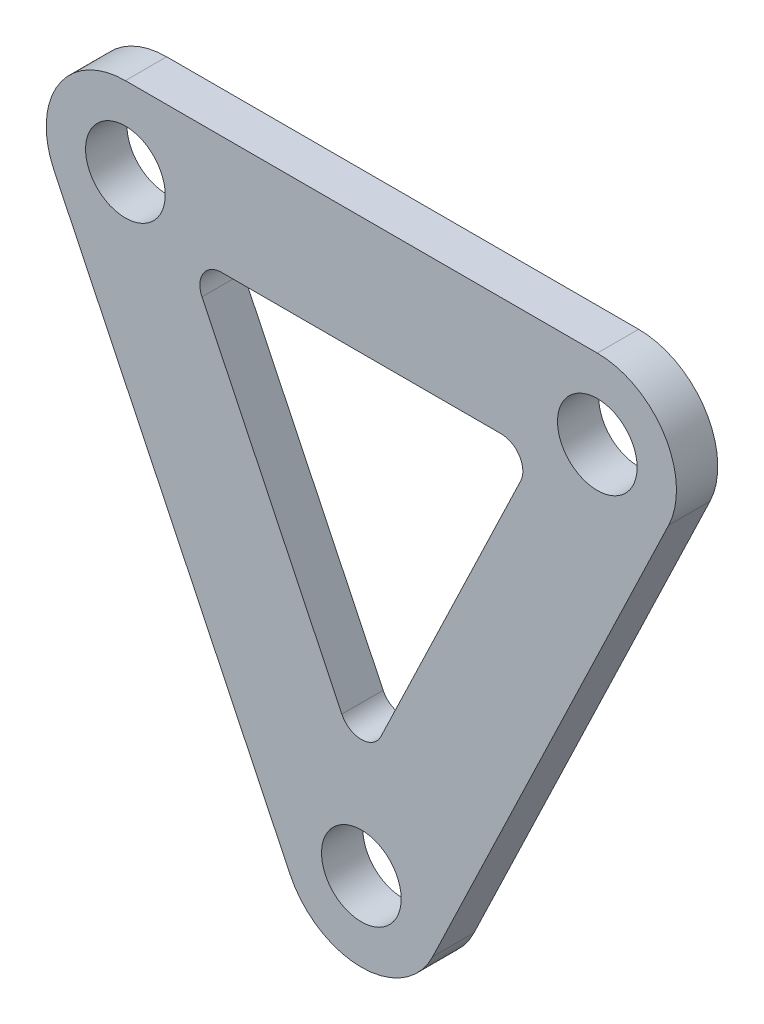
ISO-10303-21;
HEADER;
FILE_DESCRIPTION(('STEP AP214'),'2;1');
FILE_NAME('part.step','',(''),(''),'','','');
FILE_SCHEMA(('AUTOMOTIVE_DESIGN { 1 0 10303 214 1 1 1 1 }'));
ENDSEC;
DATA;
#1=APPLICATION_CONTEXT('core data for automotive mechanical design processes');
#2=APPLICATION_PROTOCOL_DEFINITION('international standard','automotive_design',2000,#1);
#3=PRODUCT_CONTEXT('',#1,'mechanical');
#4=PRODUCT('Part','Part','',(#3));
#5=PRODUCT_RELATED_PRODUCT_CATEGORY('part','',(#4));
#6=PRODUCT_DEFINITION_FORMATION('','',#4);
#7=PRODUCT_DEFINITION_CONTEXT('part definition',#1,'design');
#8=PRODUCT_DEFINITION('design','',#6,#7);
#9=PRODUCT_DEFINITION_SHAPE('','',#8);
#10=(LENGTH_UNIT() NAMED_UNIT(*) SI_UNIT(.MILLI.,.METRE.));
#11=(NAMED_UNIT(*) PLANE_ANGLE_UNIT() SI_UNIT($,.RADIAN.));
#12=(NAMED_UNIT(*) SI_UNIT($,.STERADIAN.) SOLID_ANGLE_UNIT());
#13=UNCERTAINTY_MEASURE_WITH_UNIT(LENGTH_MEASURE(1.E-05),#10,'distance_accuracy_value','');
#14=(GEOMETRIC_REPRESENTATION_CONTEXT(3) GLOBAL_UNCERTAINTY_ASSIGNED_CONTEXT((#13)) GLOBAL_UNIT_ASSIGNED_CONTEXT((#10,
#11,#12)) REPRESENTATION_CONTEXT('',''));
#15=CARTESIAN_POINT('',(0.,0.,0.));
#16=DIRECTION('',(0.,0.,1.));
#17=DIRECTION('',(1.,0.,0.));
#18=AXIS2_PLACEMENT_3D('',#15,#16,#17);
#19=CARTESIAN_POINT('',(-12.,12.5,2.1));
#20=DIRECTION('',(0.,0.,1.));
#21=DIRECTION('',(1.,0.,0.));
#22=AXIS2_PLACEMENT_3D('',#19,#20,#21);
#23=PLANE('',#22);
#24=DIRECTION('',(-1.,0.,0.));
#25=VECTOR('',#24,1.);
#26=CARTESIAN_POINT('',(8.86126290942979,10.525,2.1));
#27=LINE('',#26,#25);
#28=CARTESIAN_POINT('',(7.11310554252993,10.525,2.1));
#29=VERTEX_POINT('',#28);
#30=CARTESIAN_POINT('',(-7.11310554252995,10.525,2.1));
#31=VERTEX_POINT('',#30);
#32=EDGE_CURVE('E187',#29,#31,#27,.T.);
#33=ORIENTED_EDGE('',*,*,#32,.F.);
#34=CARTESIAN_POINT('',(7.11310554252993,9.425,2.1));
#35=DIRECTION('',(0.,0.,1.));
#36=DIRECTION('',(1.,0.,0.));
#37=AXIS2_PLACEMENT_3D('',#34,#35,#36);
#38=CIRCLE('',#37,1.1);
#39=CARTESIAN_POINT('',(8.10478090574503,8.94899582565675,2.1));
#40=VERTEX_POINT('',#39);
#41=EDGE_CURVE('E175',#29,#40,#38,.F.);
#42=ORIENTED_EDGE('',*,*,#41,.T.);
#43=DIRECTION('',(0.432731067584771,0.901523057468274,0.));
#44=VECTOR('',#43,1.);
#45=CARTESIAN_POINT('',(0.,-7.93596439464541,2.1));
#46=LINE('',#45,#44);
#47=CARTESIAN_POINT('',(0.991675363215095,-5.86997405461395,2.1));
#48=VERTEX_POINT('',#47);
#49=EDGE_CURVE('E209',#48,#40,#46,.T.);
#50=ORIENTED_EDGE('',*,*,#49,.F.);
#51=CARTESIAN_POINT('',(0.,-5.3939698802707,2.1));
#52=DIRECTION('',(0.,0.,1.));
#53=DIRECTION('',(1.,0.,0.));
#54=AXIS2_PLACEMENT_3D('',#51,#52,#53);
#55=CIRCLE('',#54,1.1);
#56=CARTESIAN_POINT('',(-0.991675363215105,-5.86997405461396,2.1));
#57=VERTEX_POINT('',#56);
#58=EDGE_CURVE('E179',#48,#57,#55,.F.);
#59=ORIENTED_EDGE('',*,*,#58,.T.);
#60=DIRECTION('',(0.432731067584771,-0.901523057468274,0.));
#61=VECTOR('',#60,1.);
#62=CARTESIAN_POINT('',(-8.86126290942981,10.525,2.1));
#63=LINE('',#62,#61);
#64=CARTESIAN_POINT('',(-8.10478090574505,8.94899582565675,2.1));
#65=VERTEX_POINT('',#64);
#66=EDGE_CURVE('E188',#65,#57,#63,.T.);
#67=ORIENTED_EDGE('',*,*,#66,.F.);
#68=CARTESIAN_POINT('',(-7.11310554252994,9.425,2.1));
#69=DIRECTION('',(0.,0.,1.));
#70=DIRECTION('',(1.,0.,0.));
#71=AXIS2_PLACEMENT_3D('',#68,#69,#70);
#72=CIRCLE('',#71,1.1);
#73=EDGE_CURVE('E43',#65,#31,#72,.F.);
#74=ORIENTED_EDGE('',*,*,#73,.T.);
#75=EDGE_LOOP('',(#33,#42,#50,#59,#67,#74));
#76=FACE_BOUND('',#75,.T.);
#77=CARTESIAN_POINT('',(12.,12.5,2.1));
#78=DIRECTION('',(0.,0.,1.));
#79=DIRECTION('',(1.,0.,0.));
#80=AXIS2_PLACEMENT_3D('',#77,#78,#79);
#81=CIRCLE('',#80,2.025);
#82=CARTESIAN_POINT('',(14.025,12.5,2.1));
#83=VERTEX_POINT('',#82);
#84=EDGE_CURVE('E221',#83,#83,#81,.T.);
#85=ORIENTED_EDGE('',*,*,#84,.F.);
#86=EDGE_LOOP('',(#85));
#87=FACE_BOUND('',#86,.T.);
#88=CARTESIAN_POINT('',(-12.,12.5,2.1));
#89=DIRECTION('',(0.,0.,1.));
#90=DIRECTION('',(1.,0.,0.));
#91=AXIS2_PLACEMENT_3D('',#88,#89,#90);
#92=CIRCLE('',#91,4.025);
#93=CARTESIAN_POINT('',(-12.,16.525,2.1));
#94=VERTEX_POINT('',#93);
#95=CARTESIAN_POINT('',(-15.6286303063098,10.7582574529713,2.1));
#96=VERTEX_POINT('',#95);
#97=EDGE_CURVE('E135',#94,#96,#92,.T.);
#98=ORIENTED_EDGE('',*,*,#97,.T.);
#99=DIRECTION('',(0.432731067584771,-0.901523057468274,0.));
#100=VECTOR('',#99,1.);
#101=CARTESIAN_POINT('',(-15.6286303063098,10.7582574529713,2.1));
#102=LINE('',#101,#100);
#103=CARTESIAN_POINT('',(-3.62863030630981,-14.2417425470287,2.1));
#104=VERTEX_POINT('',#103);
#105=EDGE_CURVE('E124',#96,#104,#102,.T.);
#106=ORIENTED_EDGE('',*,*,#105,.T.);
#107=CARTESIAN_POINT('',(0.,-12.5,2.1));
#108=DIRECTION('',(0.,0.,1.));
#109=DIRECTION('',(1.,0.,0.));
#110=AXIS2_PLACEMENT_3D('',#107,#108,#109);
#111=CIRCLE('',#110,4.025);
#112=CARTESIAN_POINT('',(3.62863030630979,-14.2417425470287,2.1));
#113=VERTEX_POINT('',#112);
#114=EDGE_CURVE('E134',#104,#113,#111,.T.);
#115=ORIENTED_EDGE('',*,*,#114,.T.);
#116=DIRECTION('',(0.432731067584771,0.901523057468274,0.));
#117=VECTOR('',#116,1.);
#118=CARTESIAN_POINT('',(15.6286303063098,10.7582574529713,2.1));
#119=LINE('',#118,#117);
#120=CARTESIAN_POINT('',(15.6286303063098,10.7582574529713,2.1));
#121=VERTEX_POINT('',#120);
#122=EDGE_CURVE('E233',#113,#121,#119,.T.);
#123=ORIENTED_EDGE('',*,*,#122,.T.);
#124=CARTESIAN_POINT('',(12.,12.5,2.1));
#125=DIRECTION('',(0.,0.,1.));
#126=DIRECTION('',(1.,0.,0.));
#127=AXIS2_PLACEMENT_3D('',#124,#125,#126);
#128=CIRCLE('',#127,4.025);
#129=CARTESIAN_POINT('',(12.,16.525,2.1));
#130=VERTEX_POINT('',#129);
#131=EDGE_CURVE('E235',#121,#130,#128,.T.);
#132=ORIENTED_EDGE('',*,*,#131,.T.);
#133=DIRECTION('',(-1.,0.,0.));
#134=VECTOR('',#133,1.);
#135=CARTESIAN_POINT('',(-12.,16.525,2.1));
#136=LINE('',#135,#134);
#137=EDGE_CURVE('E140',#130,#94,#136,.T.);
#138=ORIENTED_EDGE('',*,*,#137,.T.);
#139=EDGE_LOOP('',(#98,#106,#115,#123,#132,#138));
#140=FACE_BOUND('',#139,.T.);
#141=CARTESIAN_POINT('',(-12.,12.5,2.1));
#142=DIRECTION('',(0.,0.,1.));
#143=DIRECTION('',(1.,0.,0.));
#144=AXIS2_PLACEMENT_3D('',#141,#142,#143);
#145=CIRCLE('',#144,2.025);
#146=CARTESIAN_POINT('',(-9.97500000000001,12.5,2.1));
#147=VERTEX_POINT('',#146);
#148=EDGE_CURVE('E227',#147,#147,#145,.T.);
#149=ORIENTED_EDGE('',*,*,#148,.F.);
#150=EDGE_LOOP('',(#149));
#151=FACE_BOUND('',#150,.T.);
#152=CARTESIAN_POINT('',(0.,-12.5,2.1));
#153=DIRECTION('',(0.,0.,1.));
#154=DIRECTION('',(1.,0.,0.));
#155=AXIS2_PLACEMENT_3D('',#152,#153,#154);
#156=CIRCLE('',#155,2.025);
#157=CARTESIAN_POINT('',(2.02499999999999,-12.5,2.1));
#158=VERTEX_POINT('',#157);
#159=EDGE_CURVE('E214',#158,#158,#156,.T.);
#160=ORIENTED_EDGE('',*,*,#159,.F.);
#161=EDGE_LOOP('',(#160));
#162=FACE_BOUND('',#161,.T.);
#163=ADVANCED_FACE('F35',(#76,#87,#140,#151,#162),#23,.T.);
#164=CARTESIAN_POINT('',(-12.,12.5,0.));
#165=DIRECTION('',(0.,0.,1.));
#166=DIRECTION('',(1.,0.,0.));
#167=AXIS2_PLACEMENT_3D('',#164,#165,#166);
#168=PLANE('',#167);
#169=DIRECTION('',(0.432731067584771,-0.901523057468274,0.));
#170=VECTOR('',#169,1.);
#171=CARTESIAN_POINT('',(-10.2194919615002,13.3546438584799,0.));
#172=LINE('',#171,#170);
#173=CARTESIAN_POINT('',(-8.10478090574505,8.94899582565675,0.));
#174=VERTEX_POINT('',#173);
#175=CARTESIAN_POINT('',(-0.991675363215108,-5.86997405461395,0.));
#176=VERTEX_POINT('',#175);
#177=EDGE_CURVE('E149',#174,#176,#172,.T.);
#178=ORIENTED_EDGE('',*,*,#177,.T.);
#179=CARTESIAN_POINT('',(0.,-5.3939698802707,0.));
#180=DIRECTION('',(0.,0.,1.));
#181=DIRECTION('',(1.,0.,0.));
#182=AXIS2_PLACEMENT_3D('',#179,#180,#181);
#183=CIRCLE('',#182,1.1);
#184=CARTESIAN_POINT('',(0.991675363215093,-5.86997405461395,0.));
#185=VERTEX_POINT('',#184);
#186=EDGE_CURVE('E181',#176,#185,#183,.T.);
#187=ORIENTED_EDGE('',*,*,#186,.T.);
#188=DIRECTION('',(0.432731067584771,0.901523057468274,0.));
#189=VECTOR('',#188,1.);
#190=CARTESIAN_POINT('',(5.72534371702681,3.99183501582713,0.));
#191=LINE('',#190,#189);
#192=CARTESIAN_POINT('',(8.10478090574503,8.94899582565675,0.));
#193=VERTEX_POINT('',#192);
#194=EDGE_CURVE('E151',#185,#193,#191,.T.);
#195=ORIENTED_EDGE('',*,*,#194,.T.);
#196=CARTESIAN_POINT('',(7.11310554252993,9.425,0.));
#197=DIRECTION('',(0.,0.,1.));
#198=DIRECTION('',(1.,0.,0.));
#199=AXIS2_PLACEMENT_3D('',#196,#197,#198);
#200=CIRCLE('',#199,1.1);
#201=CARTESIAN_POINT('',(7.11310554252993,10.525,0.));
#202=VERTEX_POINT('',#201);
#203=EDGE_CURVE('E177',#193,#202,#200,.T.);
#204=ORIENTED_EDGE('',*,*,#203,.T.);
#205=DIRECTION('',(-1.,0.,0.));
#206=VECTOR('',#205,1.);
#207=CARTESIAN_POINT('',(-12.,10.525,0.));
#208=LINE('',#207,#206);
#209=CARTESIAN_POINT('',(-7.11310554252994,10.525,0.));
#210=VERTEX_POINT('',#209);
#211=EDGE_CURVE('E159',#202,#210,#208,.T.);
#212=ORIENTED_EDGE('',*,*,#211,.T.);
#213=CARTESIAN_POINT('',(-7.11310554252994,9.425,0.));
#214=DIRECTION('',(0.,0.,1.));
#215=DIRECTION('',(1.,0.,0.));
#216=AXIS2_PLACEMENT_3D('',#213,#214,#215);
#217=CIRCLE('',#216,1.1);
#218=EDGE_CURVE('E11',#210,#174,#217,.T.);
#219=ORIENTED_EDGE('',*,*,#218,.T.);
#220=EDGE_LOOP('',(#178,#187,#195,#204,#212,#219));
#221=FACE_BOUND('',#220,.T.);
#222=CARTESIAN_POINT('',(-12.,12.5,0.));
#223=DIRECTION('',(0.,0.,1.));
#224=DIRECTION('',(1.,0.,0.));
#225=AXIS2_PLACEMENT_3D('',#222,#223,#224);
#226=CIRCLE('',#225,4.025);
#227=CARTESIAN_POINT('',(-12.,16.525,0.));
#228=VERTEX_POINT('',#227);
#229=CARTESIAN_POINT('',(-15.6286303063098,10.7582574529713,0.));
#230=VERTEX_POINT('',#229);
#231=EDGE_CURVE('E148',#228,#230,#226,.T.);
#232=ORIENTED_EDGE('',*,*,#231,.F.);
#233=DIRECTION('',(-1.,0.,0.));
#234=VECTOR('',#233,1.);
#235=CARTESIAN_POINT('',(-12.,16.525,0.));
#236=LINE('',#235,#234);
#237=CARTESIAN_POINT('',(12.,16.525,0.));
#238=VERTEX_POINT('',#237);
#239=EDGE_CURVE('E144',#238,#228,#236,.T.);
#240=ORIENTED_EDGE('',*,*,#239,.F.);
#241=CARTESIAN_POINT('',(12.,12.5,0.));
#242=DIRECTION('',(0.,0.,1.));
#243=DIRECTION('',(1.,0.,0.));
#244=AXIS2_PLACEMENT_3D('',#241,#242,#243);
#245=CIRCLE('',#244,4.025);
#246=CARTESIAN_POINT('',(15.6286303063098,10.7582574529713,0.));
#247=VERTEX_POINT('',#246);
#248=EDGE_CURVE('E246',#247,#238,#245,.T.);
#249=ORIENTED_EDGE('',*,*,#248,.F.);
#250=DIRECTION('',(0.432731067584771,0.901523057468274,0.));
#251=VECTOR('',#250,1.);
#252=CARTESIAN_POINT('',(15.6286303063098,10.7582574529713,0.));
#253=LINE('',#252,#251);
#254=CARTESIAN_POINT('',(3.62863030630979,-14.2417425470287,0.));
#255=VERTEX_POINT('',#254);
#256=EDGE_CURVE('E244',#255,#247,#253,.T.);
#257=ORIENTED_EDGE('',*,*,#256,.F.);
#258=CARTESIAN_POINT('',(0.,-12.5,0.));
#259=DIRECTION('',(0.,0.,1.));
#260=DIRECTION('',(1.,0.,0.));
#261=AXIS2_PLACEMENT_3D('',#258,#259,#260);
#262=CIRCLE('',#261,4.025);
#263=CARTESIAN_POINT('',(-3.62863030630981,-14.2417425470287,0.));
#264=VERTEX_POINT('',#263);
#265=EDGE_CURVE('E242',#264,#255,#262,.T.);
#266=ORIENTED_EDGE('',*,*,#265,.F.);
#267=DIRECTION('',(0.432731067584771,-0.901523057468274,0.));
#268=VECTOR('',#267,1.);
#269=CARTESIAN_POINT('',(-15.6286303063098,10.7582574529713,0.));
#270=LINE('',#269,#268);
#271=EDGE_CURVE('E240',#230,#264,#270,.T.);
#272=ORIENTED_EDGE('',*,*,#271,.F.);
#273=EDGE_LOOP('',(#232,#240,#249,#257,#266,#272));
#274=FACE_BOUND('',#273,.T.);
#275=CARTESIAN_POINT('',(-12.,12.5,0.));
#276=DIRECTION('',(0.,0.,1.));
#277=DIRECTION('',(1.,0.,0.));
#278=AXIS2_PLACEMENT_3D('',#275,#276,#277);
#279=CIRCLE('',#278,2.025);
#280=CARTESIAN_POINT('',(-9.97500000000001,12.5,0.));
#281=VERTEX_POINT('',#280);
#282=EDGE_CURVE('E224',#281,#281,#279,.T.);
#283=ORIENTED_EDGE('',*,*,#282,.T.);
#284=EDGE_LOOP('',(#283));
#285=FACE_BOUND('',#284,.T.);
#286=CARTESIAN_POINT('',(12.,12.5,0.));
#287=DIRECTION('',(0.,0.,1.));
#288=DIRECTION('',(1.,0.,0.));
#289=AXIS2_PLACEMENT_3D('',#286,#287,#288);
#290=CIRCLE('',#289,2.025);
#291=CARTESIAN_POINT('',(14.025,12.5,0.));
#292=VERTEX_POINT('',#291);
#293=EDGE_CURVE('E219',#292,#292,#290,.T.);
#294=ORIENTED_EDGE('',*,*,#293,.T.);
#295=EDGE_LOOP('',(#294));
#296=FACE_BOUND('',#295,.T.);
#297=CARTESIAN_POINT('',(0.,-12.5,0.));
#298=DIRECTION('',(0.,0.,1.));
#299=DIRECTION('',(1.,0.,0.));
#300=AXIS2_PLACEMENT_3D('',#297,#298,#299);
#301=CIRCLE('',#300,2.025);
#302=CARTESIAN_POINT('',(2.02499999999999,-12.5,0.));
#303=VERTEX_POINT('',#302);
#304=EDGE_CURVE('E211',#303,#303,#301,.T.);
#305=ORIENTED_EDGE('',*,*,#304,.T.);
#306=EDGE_LOOP('',(#305));
#307=FACE_BOUND('',#306,.T.);
#308=ADVANCED_FACE('F199',(#221,#274,#285,#296,#307),#168,.F.);
#309=CARTESIAN_POINT('',(-12.,12.5,2.1));
#310=DIRECTION('',(0.,0.,-1.));
#311=DIRECTION('',(-1.,0.,0.));
#312=AXIS2_PLACEMENT_3D('',#309,#310,#311);
#313=CYLINDRICAL_SURFACE('',#312,4.025);
#314=ORIENTED_EDGE('',*,*,#231,.T.);
#315=DIRECTION('',(0.,0.,-1.));
#316=VECTOR('',#315,1.);
#317=CARTESIAN_POINT('',(-15.6286303063098,10.7582574529713,2.1));
#318=LINE('',#317,#316);
#319=EDGE_CURVE('E128',#96,#230,#318,.T.);
#320=ORIENTED_EDGE('',*,*,#319,.F.);
#321=ORIENTED_EDGE('',*,*,#97,.F.);
#322=DIRECTION('',(0.,0.,-1.));
#323=VECTOR('',#322,1.);
#324=CARTESIAN_POINT('',(-12.,16.525,2.1));
#325=LINE('',#324,#323);
#326=EDGE_CURVE('E238',#94,#228,#325,.T.);
#327=ORIENTED_EDGE('',*,*,#326,.T.);
#328=EDGE_LOOP('',(#314,#320,#321,#327));
#329=FACE_BOUND('',#328,.T.);
#330=ADVANCED_FACE('F146',(#329),#313,.T.);
#331=CARTESIAN_POINT('',(-15.6286303063098,10.7582574529713,2.1));
#332=DIRECTION('',(0.901523057468274,0.432731067584771,0.));
#333=DIRECTION('',(-0.432731067584771,0.901523057468273,0.));
#334=AXIS2_PLACEMENT_3D('',#331,#332,#333);
#335=PLANE('',#334);
#336=ORIENTED_EDGE('',*,*,#271,.T.);
#337=DIRECTION('',(0.,0.,-1.));
#338=VECTOR('',#337,1.);
#339=CARTESIAN_POINT('',(-3.62863030630981,-14.2417425470287,2.1));
#340=LINE('',#339,#338);
#341=EDGE_CURVE('E131',#104,#264,#340,.T.);
#342=ORIENTED_EDGE('',*,*,#341,.F.);
#343=ORIENTED_EDGE('',*,*,#105,.F.);
#344=ORIENTED_EDGE('',*,*,#319,.T.);
#345=EDGE_LOOP('',(#336,#342,#343,#344));
#346=FACE_BOUND('',#345,.T.);
#347=ADVANCED_FACE('F126',(#346),#335,.F.);
#348=CARTESIAN_POINT('',(0.,-12.5,2.1));
#349=DIRECTION('',(0.,0.,-1.));
#350=DIRECTION('',(-1.,0.,0.));
#351=AXIS2_PLACEMENT_3D('',#348,#349,#350);
#352=CYLINDRICAL_SURFACE('',#351,4.025);
#353=ORIENTED_EDGE('',*,*,#265,.T.);
#354=DIRECTION('',(0.,0.,-1.));
#355=VECTOR('',#354,1.);
#356=CARTESIAN_POINT('',(3.62863030630979,-14.2417425470287,2.1));
#357=LINE('',#356,#355);
#358=EDGE_CURVE('E153',#113,#255,#357,.T.);
#359=ORIENTED_EDGE('',*,*,#358,.F.);
#360=ORIENTED_EDGE('',*,*,#114,.F.);
#361=ORIENTED_EDGE('',*,*,#341,.T.);
#362=EDGE_LOOP('',(#353,#359,#360,#361));
#363=FACE_BOUND('',#362,.T.);
#364=ADVANCED_FACE('F273',(#363),#352,.T.);
#365=CARTESIAN_POINT('',(15.6286303063098,10.7582574529713,2.1));
#366=DIRECTION('',(-0.901523057468274,0.432731067584771,0.));
#367=DIRECTION('',(-0.432731067584771,-0.901523057468274,0.));
#368=AXIS2_PLACEMENT_3D('',#365,#366,#367);
#369=PLANE('',#368);
#370=ORIENTED_EDGE('',*,*,#256,.T.);
#371=DIRECTION('',(0.,0.,-1.));
#372=VECTOR('',#371,1.);
#373=CARTESIAN_POINT('',(15.6286303063098,10.7582574529713,2.1));
#374=LINE('',#373,#372);
#375=EDGE_CURVE('E253',#121,#247,#374,.T.);
#376=ORIENTED_EDGE('',*,*,#375,.F.);
#377=ORIENTED_EDGE('',*,*,#122,.F.);
#378=ORIENTED_EDGE('',*,*,#358,.T.);
#379=EDGE_LOOP('',(#370,#376,#377,#378));
#380=FACE_BOUND('',#379,.T.);
#381=ADVANCED_FACE('F260',(#380),#369,.F.);
#382=CARTESIAN_POINT('',(12.,12.5,2.1));
#383=DIRECTION('',(0.,0.,-1.));
#384=DIRECTION('',(-1.,0.,0.));
#385=AXIS2_PLACEMENT_3D('',#382,#383,#384);
#386=CYLINDRICAL_SURFACE('',#385,4.025);
#387=ORIENTED_EDGE('',*,*,#248,.T.);
#388=DIRECTION('',(0.,0.,-1.));
#389=VECTOR('',#388,1.);
#390=CARTESIAN_POINT('',(12.,16.525,2.1));
#391=LINE('',#390,#389);
#392=EDGE_CURVE('E250',#130,#238,#391,.T.);
#393=ORIENTED_EDGE('',*,*,#392,.F.);
#394=ORIENTED_EDGE('',*,*,#131,.F.);
#395=ORIENTED_EDGE('',*,*,#375,.T.);
#396=EDGE_LOOP('',(#387,#393,#394,#395));
#397=FACE_BOUND('',#396,.T.);
#398=ADVANCED_FACE('F269',(#397),#386,.T.);
#399=CARTESIAN_POINT('',(-12.,16.525,2.1));
#400=DIRECTION('',(0.,-1.,0.));
#401=DIRECTION('',(0.,0.,-1.));
#402=AXIS2_PLACEMENT_3D('',#399,#400,#401);
#403=PLANE('',#402);
#404=ORIENTED_EDGE('',*,*,#239,.T.);
#405=ORIENTED_EDGE('',*,*,#326,.F.);
#406=ORIENTED_EDGE('',*,*,#137,.F.);
#407=ORIENTED_EDGE('',*,*,#392,.T.);
#408=EDGE_LOOP('',(#404,#405,#406,#407));
#409=FACE_BOUND('',#408,.T.);
#410=ADVANCED_FACE('F272',(#409),#403,.F.);
#411=CARTESIAN_POINT('',(-12.,12.5,2.1));
#412=DIRECTION('',(0.,0.,-1.));
#413=DIRECTION('',(-1.,0.,0.));
#414=AXIS2_PLACEMENT_3D('',#411,#412,#413);
#415=CYLINDRICAL_SURFACE('',#414,2.025);
#416=ORIENTED_EDGE('',*,*,#148,.T.);
#417=EDGE_LOOP('',(#416));
#418=FACE_BOUND('',#417,.T.);
#419=ORIENTED_EDGE('',*,*,#282,.F.);
#420=EDGE_LOOP('',(#419));
#421=FACE_BOUND('',#420,.T.);
#422=ADVANCED_FACE('F289',(#418,#421),#415,.F.);
#423=CARTESIAN_POINT('',(12.,12.5,2.1));
#424=DIRECTION('',(0.,0.,-1.));
#425=DIRECTION('',(-1.,0.,0.));
#426=AXIS2_PLACEMENT_3D('',#423,#424,#425);
#427=CYLINDRICAL_SURFACE('',#426,2.025);
#428=ORIENTED_EDGE('',*,*,#84,.T.);
#429=EDGE_LOOP('',(#428));
#430=FACE_BOUND('',#429,.T.);
#431=ORIENTED_EDGE('',*,*,#293,.F.);
#432=EDGE_LOOP('',(#431));
#433=FACE_BOUND('',#432,.T.);
#434=ADVANCED_FACE('F309',(#430,#433),#427,.F.);
#435=CARTESIAN_POINT('',(0.,-12.5,2.1));
#436=DIRECTION('',(0.,0.,-1.));
#437=DIRECTION('',(-1.,0.,0.));
#438=AXIS2_PLACEMENT_3D('',#435,#436,#437);
#439=CYLINDRICAL_SURFACE('',#438,2.025);
#440=ORIENTED_EDGE('',*,*,#159,.T.);
#441=EDGE_LOOP('',(#440));
#442=FACE_BOUND('',#441,.T.);
#443=ORIENTED_EDGE('',*,*,#304,.F.);
#444=EDGE_LOOP('',(#443));
#445=FACE_BOUND('',#444,.T.);
#446=ADVANCED_FACE('F316',(#442,#445),#439,.F.);
#447=CARTESIAN_POINT('',(8.86126290942979,10.525,-19.));
#448=DIRECTION('',(0.,1.,0.));
#449=DIRECTION('',(0.,0.,1.));
#450=AXIS2_PLACEMENT_3D('',#447,#448,#449);
#451=PLANE('',#450);
#452=ORIENTED_EDGE('',*,*,#211,.F.);
#453=DIRECTION('',(0.,0.,1.));
#454=VECTOR('',#453,1.);
#455=CARTESIAN_POINT('',(7.11310554252993,10.525,2.1));
#456=LINE('',#455,#454);
#457=EDGE_CURVE('E163',#202,#29,#456,.T.);
#458=ORIENTED_EDGE('',*,*,#457,.T.);
#459=ORIENTED_EDGE('',*,*,#32,.T.);
#460=DIRECTION('',(0.,0.,1.));
#461=VECTOR('',#460,1.);
#462=CARTESIAN_POINT('',(-7.11310554252994,10.525,0.));
#463=LINE('',#462,#461);
#464=EDGE_CURVE('E161',#31,#210,#463,.F.);
#465=ORIENTED_EDGE('',*,*,#464,.T.);
#466=EDGE_LOOP('',(#452,#458,#459,#465));
#467=FACE_BOUND('',#466,.T.);
#468=ADVANCED_FACE('F194',(#467),#451,.F.);
#469=CARTESIAN_POINT('',(0.,-7.93596439464541,-19.));
#470=DIRECTION('',(0.901523057468274,-0.432731067584771,0.));
#471=DIRECTION('',(0.432731067584771,0.901523057468274,0.));
#472=AXIS2_PLACEMENT_3D('',#469,#470,#471);
#473=PLANE('',#472);
#474=ORIENTED_EDGE('',*,*,#49,.T.);
#475=DIRECTION('',(0.,0.,1.));
#476=VECTOR('',#475,1.);
#477=CARTESIAN_POINT('',(8.10478090574503,8.94899582565675,0.));
#478=LINE('',#477,#476);
#479=EDGE_CURVE('E169',#40,#193,#478,.F.);
#480=ORIENTED_EDGE('',*,*,#479,.T.);
#481=ORIENTED_EDGE('',*,*,#194,.F.);
#482=DIRECTION('',(0.,0.,1.));
#483=VECTOR('',#482,1.);
#484=CARTESIAN_POINT('',(0.991675363215095,-5.86997405461395,2.09999999999999));
#485=LINE('',#484,#483);
#486=EDGE_CURVE('E166',#185,#48,#485,.T.);
#487=ORIENTED_EDGE('',*,*,#486,.T.);
#488=EDGE_LOOP('',(#474,#480,#481,#487));
#489=FACE_BOUND('',#488,.T.);
#490=ADVANCED_FACE('F208',(#489),#473,.F.);
#491=CARTESIAN_POINT('',(-8.86126290942981,10.525,-19.));
#492=DIRECTION('',(-0.901523057468274,-0.432731067584771,0.));
#493=DIRECTION('',(0.432731067584771,-0.901523057468274,0.));
#494=AXIS2_PLACEMENT_3D('',#491,#492,#493);
#495=PLANE('',#494);
#496=ORIENTED_EDGE('',*,*,#66,.T.);
#497=DIRECTION('',(0.,0.,1.));
#498=VECTOR('',#497,1.);
#499=CARTESIAN_POINT('',(-0.991675363215107,-5.86997405461395,0.));
#500=LINE('',#499,#498);
#501=EDGE_CURVE('E50',#57,#176,#500,.F.);
#502=ORIENTED_EDGE('',*,*,#501,.T.);
#503=ORIENTED_EDGE('',*,*,#177,.F.);
#504=DIRECTION('',(0.,0.,1.));
#505=VECTOR('',#504,1.);
#506=CARTESIAN_POINT('',(-8.10478090574505,8.94899582565675,2.09999999999999));
#507=LINE('',#506,#505);
#508=EDGE_CURVE('E171',#174,#65,#507,.T.);
#509=ORIENTED_EDGE('',*,*,#508,.T.);
#510=EDGE_LOOP('',(#496,#502,#503,#509));
#511=FACE_BOUND('',#510,.T.);
#512=ADVANCED_FACE('F197',(#511),#495,.F.);
#513=CARTESIAN_POINT('',(7.11310554252993,9.425,-19.));
#514=DIRECTION('',(0.,0.,-1.));
#515=DIRECTION('',(-1.,0.,0.));
#516=AXIS2_PLACEMENT_3D('',#513,#514,#515);
#517=CYLINDRICAL_SURFACE('',#516,1.1);
#518=ORIENTED_EDGE('',*,*,#203,.F.);
#519=ORIENTED_EDGE('',*,*,#479,.F.);
#520=ORIENTED_EDGE('',*,*,#41,.F.);
#521=ORIENTED_EDGE('',*,*,#457,.F.);
#522=EDGE_LOOP('',(#518,#519,#520,#521));
#523=FACE_BOUND('',#522,.T.);
#524=ADVANCED_FACE('F343',(#523),#517,.F.);
#525=CARTESIAN_POINT('',(0.,-5.3939698802707,-19.));
#526=DIRECTION('',(0.,0.,-1.));
#527=DIRECTION('',(-1.,0.,0.));
#528=AXIS2_PLACEMENT_3D('',#525,#526,#527);
#529=CYLINDRICAL_SURFACE('',#528,1.1);
#530=ORIENTED_EDGE('',*,*,#186,.F.);
#531=ORIENTED_EDGE('',*,*,#501,.F.);
#532=ORIENTED_EDGE('',*,*,#58,.F.);
#533=ORIENTED_EDGE('',*,*,#486,.F.);
#534=EDGE_LOOP('',(#530,#531,#532,#533));
#535=FACE_BOUND('',#534,.T.);
#536=ADVANCED_FACE('F204',(#535),#529,.F.);
#537=CARTESIAN_POINT('',(-7.11310554252994,9.425,-19.));
#538=DIRECTION('',(0.,0.,-1.));
#539=DIRECTION('',(-1.,0.,0.));
#540=AXIS2_PLACEMENT_3D('',#537,#538,#539);
#541=CYLINDRICAL_SURFACE('',#540,1.1);
#542=ORIENTED_EDGE('',*,*,#218,.F.);
#543=ORIENTED_EDGE('',*,*,#464,.F.);
#544=ORIENTED_EDGE('',*,*,#73,.F.);
#545=ORIENTED_EDGE('',*,*,#508,.F.);
#546=EDGE_LOOP('',(#542,#543,#544,#545));
#547=FACE_BOUND('',#546,.T.);
#548=ADVANCED_FACE('F37',(#547),#541,.F.);
#549=CLOSED_SHELL('',(#163,#308,#330,#347,#364,#381,#398,#410,#422,#434,#446,#468,#490,#512,
#524,#536,#548));
#550=MANIFOLD_SOLID_BREP('B2',#549);
#551=ADVANCED_BREP_SHAPE_REPRESENTATION('',(#18,#550),#14);
#552=SHAPE_DEFINITION_REPRESENTATION(#9,#551);
ENDSEC;
END-ISO-10303-21;
